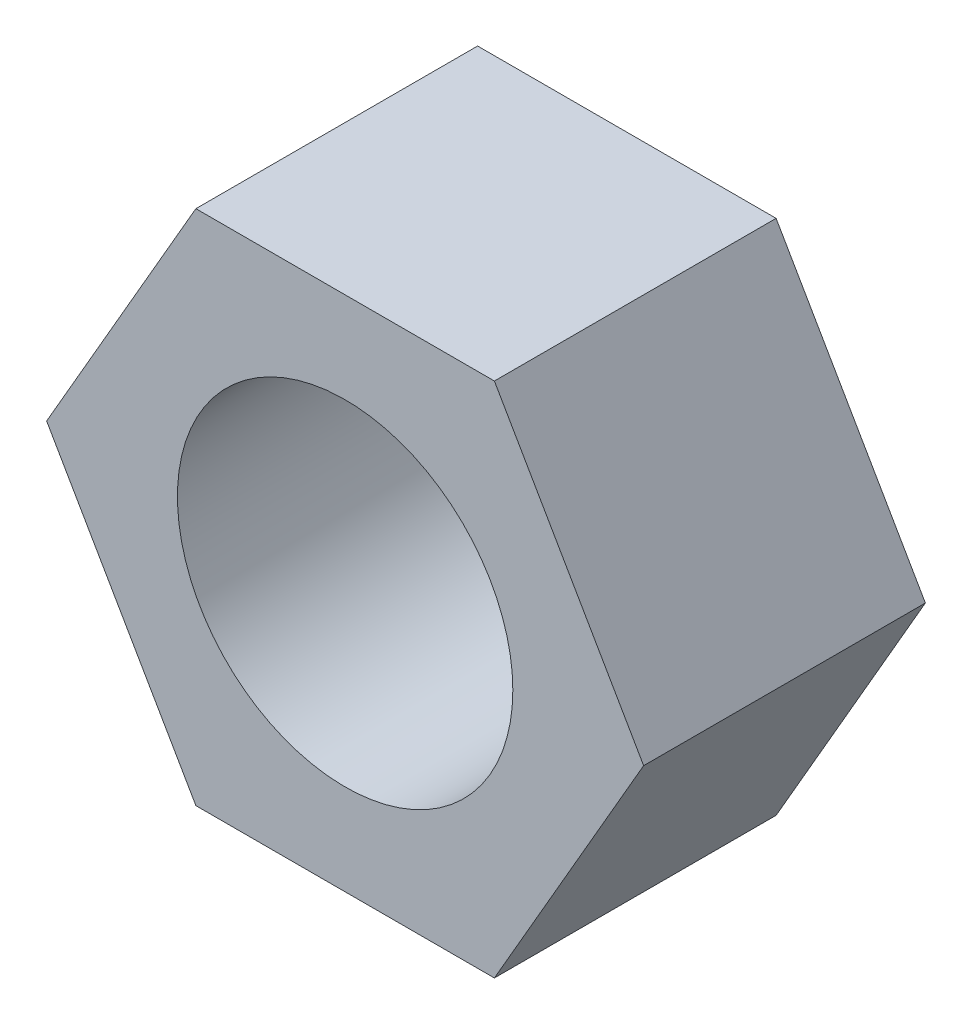
ISO-10303-21;
HEADER;
FILE_DESCRIPTION(('STEP AP214'),'2;1');
FILE_NAME('part.step','',(''),(''),'','','');
FILE_SCHEMA(('AUTOMOTIVE_DESIGN { 1 0 10303 214 1 1 1 1 }'));
ENDSEC;
DATA;
#1=APPLICATION_CONTEXT('core data for automotive mechanical design processes');
#2=APPLICATION_PROTOCOL_DEFINITION('international standard','automotive_design',2000,#1);
#3=PRODUCT_CONTEXT('',#1,'mechanical');
#4=PRODUCT('Part','Part','',(#3));
#5=PRODUCT_RELATED_PRODUCT_CATEGORY('part','',(#4));
#6=PRODUCT_DEFINITION_FORMATION('','',#4);
#7=PRODUCT_DEFINITION_CONTEXT('part definition',#1,'design');
#8=PRODUCT_DEFINITION('design','',#6,#7);
#9=PRODUCT_DEFINITION_SHAPE('','',#8);
#10=(LENGTH_UNIT() NAMED_UNIT(*) SI_UNIT(.MILLI.,.METRE.));
#11=(NAMED_UNIT(*) PLANE_ANGLE_UNIT() SI_UNIT($,.RADIAN.));
#12=(NAMED_UNIT(*) SI_UNIT($,.STERADIAN.) SOLID_ANGLE_UNIT());
#13=UNCERTAINTY_MEASURE_WITH_UNIT(LENGTH_MEASURE(1.E-05),#10,'distance_accuracy_value','');
#14=(GEOMETRIC_REPRESENTATION_CONTEXT(3) GLOBAL_UNCERTAINTY_ASSIGNED_CONTEXT((#13)) GLOBAL_UNIT_ASSIGNED_CONTEXT((#10,
#11,#12)) REPRESENTATION_CONTEXT('',''));
#15=CARTESIAN_POINT('',(0.,0.,0.));
#16=DIRECTION('',(0.,0.,1.));
#17=DIRECTION('',(1.,0.,0.));
#18=AXIS2_PLACEMENT_3D('',#15,#16,#17);
#19=CARTESIAN_POINT('',(4.45,-7.70762609368151,8.4));
#20=DIRECTION('',(-0.866025403784439,0.5,0.));
#21=DIRECTION('',(-0.5,-0.866025403784439,0.));
#22=AXIS2_PLACEMENT_3D('',#19,#20,#21);
#23=PLANE('',#22);
#24=DIRECTION('',(0.5,0.866025403784439,0.));
#25=VECTOR('',#24,1.);
#26=CARTESIAN_POINT('',(4.45,-7.70762609368151,0.));
#27=LINE('',#26,#25);
#28=CARTESIAN_POINT('',(4.45,-7.70762609368151,0.));
#29=VERTEX_POINT('',#28);
#30=CARTESIAN_POINT('',(8.9,0.,0.));
#31=VERTEX_POINT('',#30);
#32=EDGE_CURVE('E122',#29,#31,#27,.T.);
#33=ORIENTED_EDGE('',*,*,#32,.T.);
#34=DIRECTION('',(0.,0.,-1.));
#35=VECTOR('',#34,1.);
#36=CARTESIAN_POINT('',(8.9,0.,8.4));
#37=LINE('',#36,#35);
#38=CARTESIAN_POINT('',(8.9,0.,8.4));
#39=VERTEX_POINT('',#38);
#40=EDGE_CURVE('E11',#39,#31,#37,.T.);
#41=ORIENTED_EDGE('',*,*,#40,.F.);
#42=DIRECTION('',(0.5,0.866025403784439,0.));
#43=VECTOR('',#42,1.);
#44=CARTESIAN_POINT('',(4.45,-7.70762609368151,8.4));
#45=LINE('',#44,#43);
#46=CARTESIAN_POINT('',(4.45,-7.70762609368151,8.4));
#47=VERTEX_POINT('',#46);
#48=EDGE_CURVE('E132',#47,#39,#45,.T.);
#49=ORIENTED_EDGE('',*,*,#48,.F.);
#50=DIRECTION('',(0.,0.,-1.));
#51=VECTOR('',#50,1.);
#52=CARTESIAN_POINT('',(4.45,-7.70762609368151,8.4));
#53=LINE('',#52,#51);
#54=EDGE_CURVE('E118',#47,#29,#53,.T.);
#55=ORIENTED_EDGE('',*,*,#54,.T.);
#56=EDGE_LOOP('',(#33,#41,#49,#55));
#57=FACE_BOUND('',#56,.T.);
#58=ADVANCED_FACE('F37',(#57),#23,.F.);
#59=CARTESIAN_POINT('',(8.9,0.,8.4));
#60=DIRECTION('',(-0.866025403784439,-0.5,0.));
#61=DIRECTION('',(0.5,-0.866025403784439,0.));
#62=AXIS2_PLACEMENT_3D('',#59,#60,#61);
#63=PLANE('',#62);
#64=DIRECTION('',(-0.5,0.866025403784439,0.));
#65=VECTOR('',#64,1.);
#66=CARTESIAN_POINT('',(8.9,0.,0.));
#67=LINE('',#66,#65);
#68=CARTESIAN_POINT('',(4.45,7.70762609368151,0.));
#69=VERTEX_POINT('',#68);
#70=EDGE_CURVE('E125',#31,#69,#67,.T.);
#71=ORIENTED_EDGE('',*,*,#70,.T.);
#72=DIRECTION('',(0.,0.,-1.));
#73=VECTOR('',#72,1.);
#74=CARTESIAN_POINT('',(4.45,7.70762609368151,8.4));
#75=LINE('',#74,#73);
#76=CARTESIAN_POINT('',(4.45,7.70762609368151,8.4));
#77=VERTEX_POINT('',#76);
#78=EDGE_CURVE('E46',#77,#69,#75,.T.);
#79=ORIENTED_EDGE('',*,*,#78,.F.);
#80=DIRECTION('',(-0.5,0.866025403784439,0.));
#81=VECTOR('',#80,1.);
#82=CARTESIAN_POINT('',(8.9,0.,8.4));
#83=LINE('',#82,#81);
#84=EDGE_CURVE('E91',#39,#77,#83,.T.);
#85=ORIENTED_EDGE('',*,*,#84,.F.);
#86=ORIENTED_EDGE('',*,*,#40,.T.);
#87=EDGE_LOOP('',(#71,#79,#85,#86));
#88=FACE_BOUND('',#87,.T.);
#89=ADVANCED_FACE('F158',(#88),#63,.F.);
#90=CARTESIAN_POINT('',(4.45,7.70762609368151,8.4));
#91=DIRECTION('',(0.,-1.,0.));
#92=DIRECTION('',(1.,0.,0.));
#93=AXIS2_PLACEMENT_3D('',#90,#91,#92);
#94=PLANE('',#93);
#95=DIRECTION('',(-1.,0.,0.));
#96=VECTOR('',#95,1.);
#97=CARTESIAN_POINT('',(4.45,7.70762609368151,0.));
#98=LINE('',#97,#96);
#99=CARTESIAN_POINT('',(-4.45,7.70762609368151,0.));
#100=VERTEX_POINT('',#99);
#101=EDGE_CURVE('E127',#69,#100,#98,.T.);
#102=ORIENTED_EDGE('',*,*,#101,.T.);
#103=DIRECTION('',(0.,0.,-1.));
#104=VECTOR('',#103,1.);
#105=CARTESIAN_POINT('',(-4.45,7.70762609368151,8.4));
#106=LINE('',#105,#104);
#107=CARTESIAN_POINT('',(-4.45,7.70762609368151,8.4));
#108=VERTEX_POINT('',#107);
#109=EDGE_CURVE('E113',#108,#100,#106,.T.);
#110=ORIENTED_EDGE('',*,*,#109,.F.);
#111=DIRECTION('',(-1.,0.,0.));
#112=VECTOR('',#111,1.);
#113=CARTESIAN_POINT('',(4.45,7.70762609368151,8.4));
#114=LINE('',#113,#112);
#115=EDGE_CURVE('E104',#77,#108,#114,.T.);
#116=ORIENTED_EDGE('',*,*,#115,.F.);
#117=ORIENTED_EDGE('',*,*,#78,.T.);
#118=EDGE_LOOP('',(#102,#110,#116,#117));
#119=FACE_BOUND('',#118,.T.);
#120=ADVANCED_FACE('F139',(#119),#94,.F.);
#121=CARTESIAN_POINT('',(-4.45,7.70762609368151,8.4));
#122=DIRECTION('',(0.866025403784439,-0.5,0.));
#123=DIRECTION('',(0.5,0.866025403784439,0.));
#124=AXIS2_PLACEMENT_3D('',#121,#122,#123);
#125=PLANE('',#124);
#126=DIRECTION('',(-0.5,-0.866025403784439,0.));
#127=VECTOR('',#126,1.);
#128=CARTESIAN_POINT('',(-4.45,7.70762609368151,0.));
#129=LINE('',#128,#127);
#130=CARTESIAN_POINT('',(-8.9,0.,0.));
#131=VERTEX_POINT('',#130);
#132=EDGE_CURVE('E112',#100,#131,#129,.T.);
#133=ORIENTED_EDGE('',*,*,#132,.T.);
#134=DIRECTION('',(0.,0.,-1.));
#135=VECTOR('',#134,1.);
#136=CARTESIAN_POINT('',(-8.9,0.,8.4));
#137=LINE('',#136,#135);
#138=CARTESIAN_POINT('',(-8.9,0.,8.4));
#139=VERTEX_POINT('',#138);
#140=EDGE_CURVE('E109',#139,#131,#137,.T.);
#141=ORIENTED_EDGE('',*,*,#140,.F.);
#142=DIRECTION('',(-0.5,-0.866025403784439,0.));
#143=VECTOR('',#142,1.);
#144=CARTESIAN_POINT('',(-4.45,7.70762609368151,8.4));
#145=LINE('',#144,#143);
#146=EDGE_CURVE('E98',#108,#139,#145,.T.);
#147=ORIENTED_EDGE('',*,*,#146,.F.);
#148=ORIENTED_EDGE('',*,*,#109,.T.);
#149=EDGE_LOOP('',(#133,#141,#147,#148));
#150=FACE_BOUND('',#149,.T.);
#151=ADVANCED_FACE('F110',(#150),#125,.F.);
#152=CARTESIAN_POINT('',(-8.9,0.,8.4));
#153=DIRECTION('',(0.866025403784439,0.5,0.));
#154=DIRECTION('',(-0.5,0.866025403784439,0.));
#155=AXIS2_PLACEMENT_3D('',#152,#153,#154);
#156=PLANE('',#155);
#157=DIRECTION('',(0.5,-0.866025403784439,0.));
#158=VECTOR('',#157,1.);
#159=CARTESIAN_POINT('',(-8.9,0.,0.));
#160=LINE('',#159,#158);
#161=CARTESIAN_POINT('',(-4.45,-7.70762609368151,0.));
#162=VERTEX_POINT('',#161);
#163=EDGE_CURVE('E77',#131,#162,#160,.T.);
#164=ORIENTED_EDGE('',*,*,#163,.T.);
#165=DIRECTION('',(0.,0.,-1.));
#166=VECTOR('',#165,1.);
#167=CARTESIAN_POINT('',(-4.45,-7.70762609368151,8.4));
#168=LINE('',#167,#166);
#169=CARTESIAN_POINT('',(-4.45,-7.70762609368151,8.4));
#170=VERTEX_POINT('',#169);
#171=EDGE_CURVE('E114',#170,#162,#168,.T.);
#172=ORIENTED_EDGE('',*,*,#171,.F.);
#173=DIRECTION('',(0.5,-0.866025403784439,0.));
#174=VECTOR('',#173,1.);
#175=CARTESIAN_POINT('',(-8.9,0.,8.4));
#176=LINE('',#175,#174);
#177=EDGE_CURVE('E102',#139,#170,#176,.T.);
#178=ORIENTED_EDGE('',*,*,#177,.F.);
#179=ORIENTED_EDGE('',*,*,#140,.T.);
#180=EDGE_LOOP('',(#164,#172,#178,#179));
#181=FACE_BOUND('',#180,.T.);
#182=ADVANCED_FACE('F116',(#181),#156,.F.);
#183=CARTESIAN_POINT('',(-4.45,-7.70762609368151,8.4));
#184=DIRECTION('',(0.,1.,0.));
#185=DIRECTION('',(-1.,0.,0.));
#186=AXIS2_PLACEMENT_3D('',#183,#184,#185);
#187=PLANE('',#186);
#188=DIRECTION('',(1.,0.,0.));
#189=VECTOR('',#188,1.);
#190=CARTESIAN_POINT('',(-4.45,-7.70762609368151,0.));
#191=LINE('',#190,#189);
#192=EDGE_CURVE('E83',#162,#29,#191,.T.);
#193=ORIENTED_EDGE('',*,*,#192,.T.);
#194=ORIENTED_EDGE('',*,*,#54,.F.);
#195=DIRECTION('',(1.,0.,0.));
#196=VECTOR('',#195,1.);
#197=CARTESIAN_POINT('',(-4.45,-7.70762609368151,8.4));
#198=LINE('',#197,#196);
#199=EDGE_CURVE('E54',#170,#47,#198,.T.);
#200=ORIENTED_EDGE('',*,*,#199,.F.);
#201=ORIENTED_EDGE('',*,*,#171,.T.);
#202=EDGE_LOOP('',(#193,#194,#200,#201));
#203=FACE_BOUND('',#202,.T.);
#204=ADVANCED_FACE('F146',(#203),#187,.F.);
#205=CARTESIAN_POINT('',(0.,0.,8.4));
#206=DIRECTION('',(0.,0.,1.));
#207=DIRECTION('',(1.,0.,0.));
#208=AXIS2_PLACEMENT_3D('',#205,#206,#207);
#209=PLANE('',#208);
#210=CARTESIAN_POINT('',(0.,0.,8.4));
#211=DIRECTION('',(0.,0.,1.));
#212=DIRECTION('',(1.,0.,0.));
#213=AXIS2_PLACEMENT_3D('',#210,#211,#212);
#214=CIRCLE('',#213,5.);
#215=CARTESIAN_POINT('',(5.,0.,8.4));
#216=VERTEX_POINT('',#215);
#217=EDGE_CURVE('E211',#216,#216,#214,.T.);
#218=ORIENTED_EDGE('',*,*,#217,.F.);
#219=EDGE_LOOP('',(#218));
#220=FACE_BOUND('',#219,.T.);
#221=ORIENTED_EDGE('',*,*,#48,.T.);
#222=ORIENTED_EDGE('',*,*,#84,.T.);
#223=ORIENTED_EDGE('',*,*,#115,.T.);
#224=ORIENTED_EDGE('',*,*,#146,.T.);
#225=ORIENTED_EDGE('',*,*,#177,.T.);
#226=ORIENTED_EDGE('',*,*,#199,.T.);
#227=EDGE_LOOP('',(#221,#222,#223,#224,#225,#226));
#228=FACE_BOUND('',#227,.T.);
#229=ADVANCED_FACE('F100',(#220,#228),#209,.T.);
#230=CARTESIAN_POINT('',(0.,0.,0.));
#231=DIRECTION('',(0.,0.,1.));
#232=DIRECTION('',(1.,0.,0.));
#233=AXIS2_PLACEMENT_3D('',#230,#231,#232);
#234=PLANE('',#233);
#235=CARTESIAN_POINT('',(0.,0.,0.));
#236=DIRECTION('',(0.,0.,1.));
#237=DIRECTION('',(1.,0.,0.));
#238=AXIS2_PLACEMENT_3D('',#235,#236,#237);
#239=CIRCLE('',#238,5.);
#240=CARTESIAN_POINT('',(5.,0.,0.));
#241=VERTEX_POINT('',#240);
#242=EDGE_CURVE('E40',#241,#241,#239,.T.);
#243=ORIENTED_EDGE('',*,*,#242,.T.);
#244=EDGE_LOOP('',(#243));
#245=FACE_BOUND('',#244,.T.);
#246=ORIENTED_EDGE('',*,*,#32,.F.);
#247=ORIENTED_EDGE('',*,*,#192,.F.);
#248=ORIENTED_EDGE('',*,*,#163,.F.);
#249=ORIENTED_EDGE('',*,*,#132,.F.);
#250=ORIENTED_EDGE('',*,*,#101,.F.);
#251=ORIENTED_EDGE('',*,*,#70,.F.);
#252=EDGE_LOOP('',(#246,#247,#248,#249,#250,#251));
#253=FACE_BOUND('',#252,.T.);
#254=ADVANCED_FACE('F142',(#245,#253),#234,.F.);
#255=CARTESIAN_POINT('',(0.,0.,-56.6));
#256=DIRECTION('',(0.,0.,1.));
#257=DIRECTION('',(1.,0.,0.));
#258=AXIS2_PLACEMENT_3D('',#255,#256,#257);
#259=CYLINDRICAL_SURFACE('',#258,5.);
#260=ORIENTED_EDGE('',*,*,#217,.T.);
#261=EDGE_LOOP('',(#260));
#262=FACE_BOUND('',#261,.T.);
#263=ORIENTED_EDGE('',*,*,#242,.F.);
#264=EDGE_LOOP('',(#263));
#265=FACE_BOUND('',#264,.T.);
#266=ADVANCED_FACE('F195',(#262,#265),#259,.F.);
#267=CLOSED_SHELL('',(#58,#89,#120,#151,#182,#204,#229,#254,#266));
#268=MANIFOLD_SOLID_BREP('B2',#267);
#269=ADVANCED_BREP_SHAPE_REPRESENTATION('',(#18,#268),#14);
#270=SHAPE_DEFINITION_REPRESENTATION(#9,#269);
ENDSEC;
END-ISO-10303-21;
